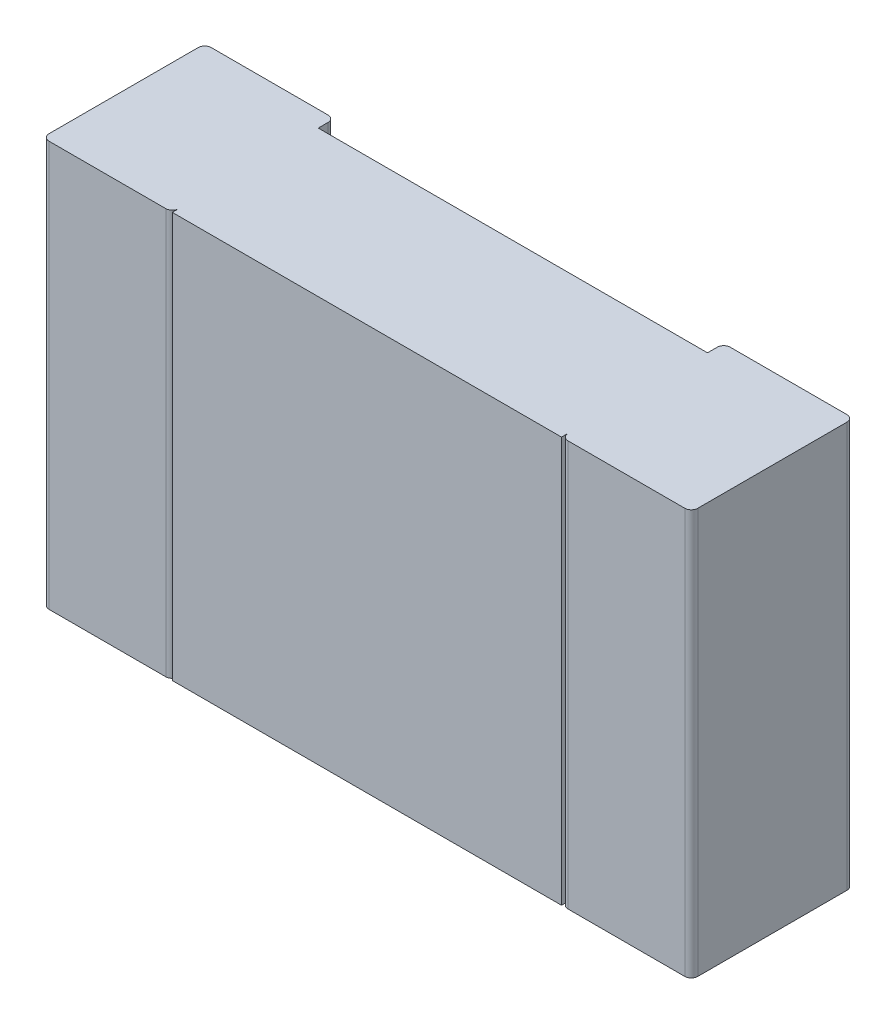
ISO-10303-21;
HEADER;
FILE_DESCRIPTION(('STEP AP214'),'2;1');
FILE_NAME('part.step','',(''),(''),'','','');
FILE_SCHEMA(('AUTOMOTIVE_DESIGN { 1 0 10303 214 1 1 1 1 }'));
ENDSEC;
DATA;
#1=APPLICATION_CONTEXT('core data for automotive mechanical design processes');
#2=APPLICATION_PROTOCOL_DEFINITION('international standard','automotive_design',2000,#1);
#3=PRODUCT_CONTEXT('',#1,'mechanical');
#4=PRODUCT('Part','Part','',(#3));
#5=PRODUCT_RELATED_PRODUCT_CATEGORY('part','',(#4));
#6=PRODUCT_DEFINITION_FORMATION('','',#4);
#7=PRODUCT_DEFINITION_CONTEXT('part definition',#1,'design');
#8=PRODUCT_DEFINITION('design','',#6,#7);
#9=PRODUCT_DEFINITION_SHAPE('','',#8);
#10=(LENGTH_UNIT() NAMED_UNIT(*) SI_UNIT(.MILLI.,.METRE.));
#11=(NAMED_UNIT(*) PLANE_ANGLE_UNIT() SI_UNIT($,.RADIAN.));
#12=(NAMED_UNIT(*) SI_UNIT($,.STERADIAN.) SOLID_ANGLE_UNIT());
#13=UNCERTAINTY_MEASURE_WITH_UNIT(LENGTH_MEASURE(1.E-05),#10,'distance_accuracy_value','');
#14=(GEOMETRIC_REPRESENTATION_CONTEXT(3) GLOBAL_UNCERTAINTY_ASSIGNED_CONTEXT((#13)) GLOBAL_UNIT_ASSIGNED_CONTEXT((#10,
#11,#12)) REPRESENTATION_CONTEXT('',''));
#15=CARTESIAN_POINT('',(0.,0.,0.));
#16=DIRECTION('',(0.,0.,1.));
#17=DIRECTION('',(1.,0.,0.));
#18=AXIS2_PLACEMENT_3D('',#15,#16,#17);
#19=CARTESIAN_POINT('',(-1.,-0.625,0.));
#20=DIRECTION('',(0.,0.,1.));
#21=DIRECTION('',(1.,0.,0.));
#22=AXIS2_PLACEMENT_3D('',#19,#20,#21);
#23=PLANE('',#22);
#24=DIRECTION('',(1.,0.,0.));
#25=VECTOR('',#24,1.);
#26=CARTESIAN_POINT('',(-1.,-0.625,0.));
#27=LINE('',#26,#25);
#28=CARTESIAN_POINT('',(-0.62,-0.625,0.));
#29=VERTEX_POINT('',#28);
#30=CARTESIAN_POINT('',(-0.98,-0.625,0.));
#31=VERTEX_POINT('',#30);
#32=EDGE_CURVE('E175',#29,#31,#27,.F.);
#33=ORIENTED_EDGE('',*,*,#32,.T.);
#34=DIRECTION('',(0.,1.,0.));
#35=VECTOR('',#34,1.);
#36=CARTESIAN_POINT('',(-0.98,-0.625,0.));
#37=LINE('',#36,#35);
#38=CARTESIAN_POINT('',(-0.98,0.625,0.));
#39=VERTEX_POINT('',#38);
#40=EDGE_CURVE('E150',#39,#31,#37,.F.);
#41=ORIENTED_EDGE('',*,*,#40,.F.);
#42=DIRECTION('',(1.,0.,0.));
#43=VECTOR('',#42,1.);
#44=CARTESIAN_POINT('',(-1.,0.625,0.));
#45=LINE('',#44,#43);
#46=CARTESIAN_POINT('',(-0.62,0.625,0.));
#47=VERTEX_POINT('',#46);
#48=EDGE_CURVE('E285',#47,#39,#45,.F.);
#49=ORIENTED_EDGE('',*,*,#48,.F.);
#50=DIRECTION('',(0.,1.,0.));
#51=VECTOR('',#50,1.);
#52=CARTESIAN_POINT('',(-0.62,-0.625,0.));
#53=LINE('',#52,#51);
#54=EDGE_CURVE('E176',#29,#47,#53,.T.);
#55=ORIENTED_EDGE('',*,*,#54,.F.);
#56=EDGE_LOOP('',(#33,#41,#49,#55));
#57=FACE_BOUND('',#56,.T.);
#58=ADVANCED_FACE('F16',(#57),#23,.F.);
#59=CARTESIAN_POINT('',(-0.98,-0.625,0.02));
#60=DIRECTION('',(0.,1.,0.));
#61=DIRECTION('',(0.,0.,1.));
#62=AXIS2_PLACEMENT_3D('',#59,#60,#61);
#63=CYLINDRICAL_SURFACE('',#62,0.02);
#64=ORIENTED_EDGE('',*,*,#40,.T.);
#65=CARTESIAN_POINT('',(-0.98,-0.625,0.02));
#66=DIRECTION('',(0.,1.,0.));
#67=DIRECTION('',(0.,0.,1.));
#68=AXIS2_PLACEMENT_3D('',#65,#66,#67);
#69=CIRCLE('',#68,0.02);
#70=CARTESIAN_POINT('',(-1.,-0.625,0.02));
#71=VERTEX_POINT('',#70);
#72=EDGE_CURVE('E19',#31,#71,#69,.T.);
#73=ORIENTED_EDGE('',*,*,#72,.T.);
#74=DIRECTION('',(0.,1.,0.));
#75=VECTOR('',#74,1.);
#76=CARTESIAN_POINT('',(-1.,-0.625,0.02));
#77=LINE('',#76,#75);
#78=CARTESIAN_POINT('',(-1.,0.625,0.02));
#79=VERTEX_POINT('',#78);
#80=EDGE_CURVE('E157',#71,#79,#77,.T.);
#81=ORIENTED_EDGE('',*,*,#80,.T.);
#82=CARTESIAN_POINT('',(-0.98,0.625,0.02));
#83=DIRECTION('',(0.,1.,0.));
#84=DIRECTION('',(0.,0.,1.));
#85=AXIS2_PLACEMENT_3D('',#82,#83,#84);
#86=CIRCLE('',#85,0.02);
#87=EDGE_CURVE('E283',#39,#79,#86,.T.);
#88=ORIENTED_EDGE('',*,*,#87,.F.);
#89=EDGE_LOOP('',(#64,#73,#81,#88));
#90=FACE_BOUND('',#89,.T.);
#91=ADVANCED_FACE('F174',(#90),#63,.T.);
#92=CARTESIAN_POINT('',(-1.,-0.625,0.));
#93=DIRECTION('',(1.,0.,0.));
#94=DIRECTION('',(0.,0.,-1.));
#95=AXIS2_PLACEMENT_3D('',#92,#93,#94);
#96=PLANE('',#95);
#97=DIRECTION('',(0.,0.,1.));
#98=VECTOR('',#97,1.);
#99=CARTESIAN_POINT('',(-1.,0.625,0.));
#100=LINE('',#99,#98);
#101=CARTESIAN_POINT('',(-1.,0.625,0.48));
#102=VERTEX_POINT('',#101);
#103=EDGE_CURVE('E162',#79,#102,#100,.T.);
#104=ORIENTED_EDGE('',*,*,#103,.F.);
#105=ORIENTED_EDGE('',*,*,#80,.F.);
#106=DIRECTION('',(0.,0.,1.));
#107=VECTOR('',#106,1.);
#108=CARTESIAN_POINT('',(-1.,-0.625,0.));
#109=LINE('',#108,#107);
#110=CARTESIAN_POINT('',(-1.,-0.625,0.48));
#111=VERTEX_POINT('',#110);
#112=EDGE_CURVE('E161',#71,#111,#109,.T.);
#113=ORIENTED_EDGE('',*,*,#112,.T.);
#114=DIRECTION('',(0.,1.,0.));
#115=VECTOR('',#114,1.);
#116=CARTESIAN_POINT('',(-1.,-0.625,0.48));
#117=LINE('',#116,#115);
#118=EDGE_CURVE('E163',#102,#111,#117,.F.);
#119=ORIENTED_EDGE('',*,*,#118,.F.);
#120=EDGE_LOOP('',(#104,#105,#113,#119));
#121=FACE_BOUND('',#120,.T.);
#122=ADVANCED_FACE('F159',(#121),#96,.F.);
#123=CARTESIAN_POINT('',(-0.98,-0.625,0.48));
#124=DIRECTION('',(0.,1.,0.));
#125=DIRECTION('',(0.,0.,1.));
#126=AXIS2_PLACEMENT_3D('',#123,#124,#125);
#127=CYLINDRICAL_SURFACE('',#126,0.02);
#128=CARTESIAN_POINT('',(-0.98,0.625,0.48));
#129=DIRECTION('',(0.,1.,0.));
#130=DIRECTION('',(0.,0.,1.));
#131=AXIS2_PLACEMENT_3D('',#128,#129,#130);
#132=CIRCLE('',#131,0.02);
#133=CARTESIAN_POINT('',(-0.98,0.625,0.5));
#134=VERTEX_POINT('',#133);
#135=EDGE_CURVE('E281',#102,#134,#132,.T.);
#136=ORIENTED_EDGE('',*,*,#135,.F.);
#137=ORIENTED_EDGE('',*,*,#118,.T.);
#138=CARTESIAN_POINT('',(-0.98,-0.625,0.48));
#139=DIRECTION('',(0.,1.,0.));
#140=DIRECTION('',(0.,0.,1.));
#141=AXIS2_PLACEMENT_3D('',#138,#139,#140);
#142=CIRCLE('',#141,0.02);
#143=CARTESIAN_POINT('',(-0.98,-0.625,0.5));
#144=VERTEX_POINT('',#143);
#145=EDGE_CURVE('E172',#111,#144,#142,.T.);
#146=ORIENTED_EDGE('',*,*,#145,.T.);
#147=DIRECTION('',(0.,1.,0.));
#148=VECTOR('',#147,1.);
#149=CARTESIAN_POINT('',(-0.98,-0.625,0.5));
#150=LINE('',#149,#148);
#151=EDGE_CURVE('E245',#134,#144,#150,.F.);
#152=ORIENTED_EDGE('',*,*,#151,.F.);
#153=EDGE_LOOP('',(#136,#137,#146,#152));
#154=FACE_BOUND('',#153,.T.);
#155=ADVANCED_FACE('F377',(#154),#127,.T.);
#156=CARTESIAN_POINT('',(-1.,-0.625,0.5));
#157=DIRECTION('',(0.,0.,1.));
#158=DIRECTION('',(1.,0.,0.));
#159=AXIS2_PLACEMENT_3D('',#156,#157,#158);
#160=PLANE('',#159);
#161=DIRECTION('',(1.,0.,0.));
#162=VECTOR('',#161,1.);
#163=CARTESIAN_POINT('',(-1.,-0.625,0.5));
#164=LINE('',#163,#162);
#165=CARTESIAN_POINT('',(-0.62,-0.625,0.5));
#166=VERTEX_POINT('',#165);
#167=EDGE_CURVE('E301',#144,#166,#164,.T.);
#168=ORIENTED_EDGE('',*,*,#167,.T.);
#169=DIRECTION('',(0.,1.,0.));
#170=VECTOR('',#169,1.);
#171=CARTESIAN_POINT('',(-0.62,-0.625,0.5));
#172=LINE('',#171,#170);
#173=CARTESIAN_POINT('',(-0.62,0.625,0.5));
#174=VERTEX_POINT('',#173);
#175=EDGE_CURVE('E242',#174,#166,#172,.F.);
#176=ORIENTED_EDGE('',*,*,#175,.F.);
#177=DIRECTION('',(1.,0.,0.));
#178=VECTOR('',#177,1.);
#179=CARTESIAN_POINT('',(-1.,0.625,0.5));
#180=LINE('',#179,#178);
#181=EDGE_CURVE('E280',#134,#174,#180,.T.);
#182=ORIENTED_EDGE('',*,*,#181,.F.);
#183=ORIENTED_EDGE('',*,*,#151,.T.);
#184=EDGE_LOOP('',(#168,#176,#182,#183));
#185=FACE_BOUND('',#184,.T.);
#186=ADVANCED_FACE('F379',(#185),#160,.T.);
#187=CARTESIAN_POINT('',(-0.62,-0.625,0.48));
#188=DIRECTION('',(0.,1.,0.));
#189=DIRECTION('',(0.,0.,1.));
#190=AXIS2_PLACEMENT_3D('',#187,#188,#189);
#191=CYLINDRICAL_SURFACE('',#190,0.02);
#192=ORIENTED_EDGE('',*,*,#175,.T.);
#193=CARTESIAN_POINT('',(-0.62,-0.625,0.48));
#194=DIRECTION('',(0.,1.,0.));
#195=DIRECTION('',(0.,0.,1.));
#196=AXIS2_PLACEMENT_3D('',#193,#194,#195);
#197=CIRCLE('',#196,0.02);
#198=CARTESIAN_POINT('',(-0.6,-0.625,0.48));
#199=VERTEX_POINT('',#198);
#200=EDGE_CURVE('E299',#166,#199,#197,.T.);
#201=ORIENTED_EDGE('',*,*,#200,.T.);
#202=DIRECTION('',(0.,1.,0.));
#203=VECTOR('',#202,1.);
#204=CARTESIAN_POINT('',(-0.6,-0.625,0.48));
#205=LINE('',#204,#203);
#206=CARTESIAN_POINT('',(-0.6,0.625,0.48));
#207=VERTEX_POINT('',#206);
#208=EDGE_CURVE('E234',#199,#207,#205,.T.);
#209=ORIENTED_EDGE('',*,*,#208,.T.);
#210=CARTESIAN_POINT('',(-0.62,0.625,0.48));
#211=DIRECTION('',(0.,1.,0.));
#212=DIRECTION('',(0.,0.,1.));
#213=AXIS2_PLACEMENT_3D('',#210,#211,#212);
#214=CIRCLE('',#213,0.02);
#215=EDGE_CURVE('E278',#174,#207,#214,.T.);
#216=ORIENTED_EDGE('',*,*,#215,.F.);
#217=EDGE_LOOP('',(#192,#201,#209,#216));
#218=FACE_BOUND('',#217,.T.);
#219=ADVANCED_FACE('F384',(#218),#191,.T.);
#220=CARTESIAN_POINT('',(-0.6,-0.625,0.45));
#221=DIRECTION('',(1.,0.,0.));
#222=DIRECTION('',(0.,0.,-1.));
#223=AXIS2_PLACEMENT_3D('',#220,#221,#222);
#224=PLANE('',#223);
#225=DIRECTION('',(0.,0.,1.));
#226=VECTOR('',#225,1.);
#227=CARTESIAN_POINT('',(-0.6,0.625,0.45));
#228=LINE('',#227,#226);
#229=CARTESIAN_POINT('',(-0.6,0.625,0.5));
#230=VERTEX_POINT('',#229);
#231=EDGE_CURVE('E230',#207,#230,#228,.T.);
#232=ORIENTED_EDGE('',*,*,#231,.F.);
#233=ORIENTED_EDGE('',*,*,#208,.F.);
#234=DIRECTION('',(0.,0.,1.));
#235=VECTOR('',#234,1.);
#236=CARTESIAN_POINT('',(-0.6,-0.625,0.45));
#237=LINE('',#236,#235);
#238=CARTESIAN_POINT('',(-0.6,-0.625,0.5));
#239=VERTEX_POINT('',#238);
#240=EDGE_CURVE('E258',#199,#239,#237,.T.);
#241=ORIENTED_EDGE('',*,*,#240,.T.);
#242=DIRECTION('',(0.,1.,0.));
#243=VECTOR('',#242,1.);
#244=CARTESIAN_POINT('',(-0.6,-0.625,0.5));
#245=LINE('',#244,#243);
#246=EDGE_CURVE('E226',#230,#239,#245,.F.);
#247=ORIENTED_EDGE('',*,*,#246,.F.);
#248=EDGE_LOOP('',(#232,#233,#241,#247));
#249=FACE_BOUND('',#248,.T.);
#250=ADVANCED_FACE('F387',(#249),#224,.F.);
#251=CARTESIAN_POINT('',(-0.6,-0.625,0.5));
#252=DIRECTION('',(0.,0.,1.));
#253=DIRECTION('',(1.,0.,0.));
#254=AXIS2_PLACEMENT_3D('',#251,#252,#253);
#255=PLANE('',#254);
#256=DIRECTION('',(0.,1.,0.));
#257=VECTOR('',#256,1.);
#258=CARTESIAN_POINT('',(0.6,-0.625,0.5));
#259=LINE('',#258,#257);
#260=CARTESIAN_POINT('',(0.6,0.625,0.5));
#261=VERTEX_POINT('',#260);
#262=CARTESIAN_POINT('',(0.6,-0.625,0.5));
#263=VERTEX_POINT('',#262);
#264=EDGE_CURVE('E214',#261,#263,#259,.F.);
#265=ORIENTED_EDGE('',*,*,#264,.F.);
#266=DIRECTION('',(1.,0.,0.));
#267=VECTOR('',#266,1.);
#268=CARTESIAN_POINT('',(-0.6,0.625,0.5));
#269=LINE('',#268,#267);
#270=EDGE_CURVE('E218',#230,#261,#269,.T.);
#271=ORIENTED_EDGE('',*,*,#270,.F.);
#272=ORIENTED_EDGE('',*,*,#246,.T.);
#273=DIRECTION('',(1.,0.,0.));
#274=VECTOR('',#273,1.);
#275=CARTESIAN_POINT('',(-0.6,-0.625,0.5));
#276=LINE('',#275,#274);
#277=EDGE_CURVE('E253',#239,#263,#276,.T.);
#278=ORIENTED_EDGE('',*,*,#277,.T.);
#279=EDGE_LOOP('',(#265,#271,#272,#278));
#280=FACE_BOUND('',#279,.T.);
#281=ADVANCED_FACE('F392',(#280),#255,.T.);
#282=CARTESIAN_POINT('',(0.6,-0.625,0.45));
#283=DIRECTION('',(1.,0.,0.));
#284=DIRECTION('',(0.,0.,-1.));
#285=AXIS2_PLACEMENT_3D('',#282,#283,#284);
#286=PLANE('',#285);
#287=DIRECTION('',(0.,0.,1.));
#288=VECTOR('',#287,1.);
#289=CARTESIAN_POINT('',(0.6,0.625,0.45));
#290=LINE('',#289,#288);
#291=CARTESIAN_POINT('',(0.6,0.625,0.48));
#292=VERTEX_POINT('',#291);
#293=EDGE_CURVE('E215',#261,#292,#290,.F.);
#294=ORIENTED_EDGE('',*,*,#293,.F.);
#295=ORIENTED_EDGE('',*,*,#264,.T.);
#296=DIRECTION('',(0.,0.,1.));
#297=VECTOR('',#296,1.);
#298=CARTESIAN_POINT('',(0.6,-0.625,0.45));
#299=LINE('',#298,#297);
#300=CARTESIAN_POINT('',(0.6,-0.625,0.48));
#301=VERTEX_POINT('',#300);
#302=EDGE_CURVE('E249',#263,#301,#299,.F.);
#303=ORIENTED_EDGE('',*,*,#302,.T.);
#304=DIRECTION('',(0.,1.,0.));
#305=VECTOR('',#304,1.);
#306=CARTESIAN_POINT('',(0.6,-0.625,0.48));
#307=LINE('',#306,#305);
#308=EDGE_CURVE('E212',#292,#301,#307,.F.);
#309=ORIENTED_EDGE('',*,*,#308,.F.);
#310=EDGE_LOOP('',(#294,#295,#303,#309));
#311=FACE_BOUND('',#310,.T.);
#312=ADVANCED_FACE('F398',(#311),#286,.T.);
#313=CARTESIAN_POINT('',(0.6,-0.625,0.));
#314=DIRECTION('',(0.,0.,1.));
#315=DIRECTION('',(1.,0.,0.));
#316=AXIS2_PLACEMENT_3D('',#313,#314,#315);
#317=PLANE('',#316);
#318=DIRECTION('',(1.,0.,0.));
#319=VECTOR('',#318,1.);
#320=CARTESIAN_POINT('',(0.6,-0.625,0.));
#321=LINE('',#320,#319);
#322=CARTESIAN_POINT('',(0.98,-0.625,0.));
#323=VERTEX_POINT('',#322);
#324=CARTESIAN_POINT('',(0.62,-0.625,0.));
#325=VERTEX_POINT('',#324);
#326=EDGE_CURVE('E252',#323,#325,#321,.F.);
#327=ORIENTED_EDGE('',*,*,#326,.T.);
#328=DIRECTION('',(0.,1.,0.));
#329=VECTOR('',#328,1.);
#330=CARTESIAN_POINT('',(0.62,-0.625,0.));
#331=LINE('',#330,#329);
#332=CARTESIAN_POINT('',(0.62,0.625,0.));
#333=VERTEX_POINT('',#332);
#334=EDGE_CURVE('E221',#333,#325,#331,.F.);
#335=ORIENTED_EDGE('',*,*,#334,.F.);
#336=DIRECTION('',(1.,0.,0.));
#337=VECTOR('',#336,1.);
#338=CARTESIAN_POINT('',(0.6,0.625,0.));
#339=LINE('',#338,#337);
#340=CARTESIAN_POINT('',(0.98,0.625,0.));
#341=VERTEX_POINT('',#340);
#342=EDGE_CURVE('E217',#341,#333,#339,.F.);
#343=ORIENTED_EDGE('',*,*,#342,.F.);
#344=DIRECTION('',(0.,1.,0.));
#345=VECTOR('',#344,1.);
#346=CARTESIAN_POINT('',(0.98,-0.625,0.));
#347=LINE('',#346,#345);
#348=EDGE_CURVE('E203',#323,#341,#347,.T.);
#349=ORIENTED_EDGE('',*,*,#348,.F.);
#350=EDGE_LOOP('',(#327,#335,#343,#349));
#351=FACE_BOUND('',#350,.T.);
#352=ADVANCED_FACE('F354',(#351),#317,.F.);
#353=CARTESIAN_POINT('',(0.62,-0.625,0.48));
#354=DIRECTION('',(0.,1.,0.));
#355=DIRECTION('',(0.,0.,1.));
#356=AXIS2_PLACEMENT_3D('',#353,#354,#355);
#357=CYLINDRICAL_SURFACE('',#356,0.02);
#358=CARTESIAN_POINT('',(0.62,0.625,0.48));
#359=DIRECTION('',(0.,1.,0.));
#360=DIRECTION('',(0.,0.,1.));
#361=AXIS2_PLACEMENT_3D('',#358,#359,#360);
#362=CIRCLE('',#361,0.02);
#363=CARTESIAN_POINT('',(0.62,0.625,0.5));
#364=VERTEX_POINT('',#363);
#365=EDGE_CURVE('E272',#292,#364,#362,.T.);
#366=ORIENTED_EDGE('',*,*,#365,.F.);
#367=ORIENTED_EDGE('',*,*,#308,.T.);
#368=CARTESIAN_POINT('',(0.62,-0.625,0.48));
#369=DIRECTION('',(0.,1.,0.));
#370=DIRECTION('',(0.,0.,1.));
#371=AXIS2_PLACEMENT_3D('',#368,#369,#370);
#372=CIRCLE('',#371,0.02);
#373=CARTESIAN_POINT('',(0.62,-0.625,0.5));
#374=VERTEX_POINT('',#373);
#375=EDGE_CURVE('E294',#301,#374,#372,.T.);
#376=ORIENTED_EDGE('',*,*,#375,.T.);
#377=DIRECTION('',(0.,1.,0.));
#378=VECTOR('',#377,1.);
#379=CARTESIAN_POINT('',(0.62,-0.625,0.5));
#380=LINE('',#379,#378);
#381=EDGE_CURVE('E210',#364,#374,#380,.F.);
#382=ORIENTED_EDGE('',*,*,#381,.F.);
#383=EDGE_LOOP('',(#366,#367,#376,#382));
#384=FACE_BOUND('',#383,.T.);
#385=ADVANCED_FACE('F402',(#384),#357,.T.);
#386=CARTESIAN_POINT('',(0.6,-0.625,0.5));
#387=DIRECTION('',(0.,0.,1.));
#388=DIRECTION('',(1.,0.,0.));
#389=AXIS2_PLACEMENT_3D('',#386,#387,#388);
#390=PLANE('',#389);
#391=DIRECTION('',(1.,0.,0.));
#392=VECTOR('',#391,1.);
#393=CARTESIAN_POINT('',(0.6,-0.625,0.5));
#394=LINE('',#393,#392);
#395=CARTESIAN_POINT('',(0.98,-0.625,0.5));
#396=VERTEX_POINT('',#395);
#397=EDGE_CURVE('E293',#374,#396,#394,.T.);
#398=ORIENTED_EDGE('',*,*,#397,.T.);
#399=DIRECTION('',(0.,1.,0.));
#400=VECTOR('',#399,1.);
#401=CARTESIAN_POINT('',(0.98,-0.625,0.5));
#402=LINE('',#401,#400);
#403=CARTESIAN_POINT('',(0.98,0.625,0.5));
#404=VERTEX_POINT('',#403);
#405=EDGE_CURVE('E208',#404,#396,#402,.F.);
#406=ORIENTED_EDGE('',*,*,#405,.F.);
#407=DIRECTION('',(1.,0.,0.));
#408=VECTOR('',#407,1.);
#409=CARTESIAN_POINT('',(0.6,0.625,0.5));
#410=LINE('',#409,#408);
#411=EDGE_CURVE('E271',#364,#404,#410,.T.);
#412=ORIENTED_EDGE('',*,*,#411,.F.);
#413=ORIENTED_EDGE('',*,*,#381,.T.);
#414=EDGE_LOOP('',(#398,#406,#412,#413));
#415=FACE_BOUND('',#414,.T.);
#416=ADVANCED_FACE('F407',(#415),#390,.T.);
#417=CARTESIAN_POINT('',(0.98,-0.625,0.48));
#418=DIRECTION('',(0.,1.,0.));
#419=DIRECTION('',(0.,0.,1.));
#420=AXIS2_PLACEMENT_3D('',#417,#418,#419);
#421=CYLINDRICAL_SURFACE('',#420,0.02);
#422=ORIENTED_EDGE('',*,*,#405,.T.);
#423=CARTESIAN_POINT('',(0.98,-0.625,0.48));
#424=DIRECTION('',(0.,1.,0.));
#425=DIRECTION('',(0.,0.,1.));
#426=AXIS2_PLACEMENT_3D('',#423,#424,#425);
#427=CIRCLE('',#426,0.02);
#428=CARTESIAN_POINT('',(1.,-0.625,0.48));
#429=VERTEX_POINT('',#428);
#430=EDGE_CURVE('E290',#396,#429,#427,.T.);
#431=ORIENTED_EDGE('',*,*,#430,.T.);
#432=DIRECTION('',(0.,1.,0.));
#433=VECTOR('',#432,1.);
#434=CARTESIAN_POINT('',(1.,-0.625,0.48));
#435=LINE('',#434,#433);
#436=CARTESIAN_POINT('',(1.,0.625,0.48));
#437=VERTEX_POINT('',#436);
#438=EDGE_CURVE('E205',#437,#429,#435,.F.);
#439=ORIENTED_EDGE('',*,*,#438,.F.);
#440=CARTESIAN_POINT('',(0.98,0.625,0.48));
#441=DIRECTION('',(0.,1.,0.));
#442=DIRECTION('',(0.,0.,1.));
#443=AXIS2_PLACEMENT_3D('',#440,#441,#442);
#444=CIRCLE('',#443,0.02);
#445=EDGE_CURVE('E269',#404,#437,#444,.T.);
#446=ORIENTED_EDGE('',*,*,#445,.F.);
#447=EDGE_LOOP('',(#422,#431,#439,#446));
#448=FACE_BOUND('',#447,.T.);
#449=ADVANCED_FACE('F410',(#448),#421,.T.);
#450=CARTESIAN_POINT('',(1.,-0.625,0.));
#451=DIRECTION('',(1.,0.,0.));
#452=DIRECTION('',(0.,0.,-1.));
#453=AXIS2_PLACEMENT_3D('',#450,#451,#452);
#454=PLANE('',#453);
#455=DIRECTION('',(0.,0.,1.));
#456=VECTOR('',#455,1.);
#457=CARTESIAN_POINT('',(1.,0.625,0.));
#458=LINE('',#457,#456);
#459=CARTESIAN_POINT('',(1.,0.625,0.02));
#460=VERTEX_POINT('',#459);
#461=EDGE_CURVE('E268',#437,#460,#458,.F.);
#462=ORIENTED_EDGE('',*,*,#461,.F.);
#463=ORIENTED_EDGE('',*,*,#438,.T.);
#464=DIRECTION('',(0.,0.,1.));
#465=VECTOR('',#464,1.);
#466=CARTESIAN_POINT('',(1.,-0.625,0.));
#467=LINE('',#466,#465);
#468=CARTESIAN_POINT('',(1.,-0.625,0.02));
#469=VERTEX_POINT('',#468);
#470=EDGE_CURVE('E289',#429,#469,#467,.F.);
#471=ORIENTED_EDGE('',*,*,#470,.T.);
#472=DIRECTION('',(0.,1.,0.));
#473=VECTOR('',#472,1.);
#474=CARTESIAN_POINT('',(1.,-0.625,0.02));
#475=LINE('',#474,#473);
#476=EDGE_CURVE('E180',#460,#469,#475,.F.);
#477=ORIENTED_EDGE('',*,*,#476,.F.);
#478=EDGE_LOOP('',(#462,#463,#471,#477));
#479=FACE_BOUND('',#478,.T.);
#480=ADVANCED_FACE('F347',(#479),#454,.T.);
#481=CARTESIAN_POINT('',(0.98,-0.625,0.02));
#482=DIRECTION('',(0.,1.,0.));
#483=DIRECTION('',(0.,0.,1.));
#484=AXIS2_PLACEMENT_3D('',#481,#482,#483);
#485=CYLINDRICAL_SURFACE('',#484,0.02);
#486=CARTESIAN_POINT('',(0.98,0.625,0.02));
#487=DIRECTION('',(0.,1.,0.));
#488=DIRECTION('',(0.,0.,1.));
#489=AXIS2_PLACEMENT_3D('',#486,#487,#488);
#490=CIRCLE('',#489,0.02);
#491=EDGE_CURVE('E188',#460,#341,#490,.T.);
#492=ORIENTED_EDGE('',*,*,#491,.F.);
#493=ORIENTED_EDGE('',*,*,#476,.T.);
#494=CARTESIAN_POINT('',(0.98,-0.625,0.02));
#495=DIRECTION('',(0.,1.,0.));
#496=DIRECTION('',(0.,0.,1.));
#497=AXIS2_PLACEMENT_3D('',#494,#495,#496);
#498=CIRCLE('',#497,0.02);
#499=EDGE_CURVE('E224',#469,#323,#498,.T.);
#500=ORIENTED_EDGE('',*,*,#499,.T.);
#501=ORIENTED_EDGE('',*,*,#348,.T.);
#502=EDGE_LOOP('',(#492,#493,#500,#501));
#503=FACE_BOUND('',#502,.T.);
#504=ADVANCED_FACE('F351',(#503),#485,.T.);
#505=CARTESIAN_POINT('',(-0.62,-0.625,0.02));
#506=DIRECTION('',(0.,1.,0.));
#507=DIRECTION('',(0.,0.,1.));
#508=AXIS2_PLACEMENT_3D('',#505,#506,#507);
#509=CYLINDRICAL_SURFACE('',#508,0.02);
#510=CARTESIAN_POINT('',(-0.62,0.625,0.02));
#511=DIRECTION('',(0.,1.,0.));
#512=DIRECTION('',(0.,0.,1.));
#513=AXIS2_PLACEMENT_3D('',#510,#511,#512);
#514=CIRCLE('',#513,0.02);
#515=CARTESIAN_POINT('',(-0.6,0.625,0.02));
#516=VERTEX_POINT('',#515);
#517=EDGE_CURVE('E238',#516,#47,#514,.T.);
#518=ORIENTED_EDGE('',*,*,#517,.F.);
#519=DIRECTION('',(0.,1.,0.));
#520=VECTOR('',#519,1.);
#521=CARTESIAN_POINT('',(-0.6,-0.625,0.02));
#522=LINE('',#521,#520);
#523=CARTESIAN_POINT('',(-0.6,-0.625,0.02));
#524=VERTEX_POINT('',#523);
#525=EDGE_CURVE('E187',#524,#516,#522,.T.);
#526=ORIENTED_EDGE('',*,*,#525,.F.);
#527=CARTESIAN_POINT('',(-0.62,-0.625,0.02));
#528=DIRECTION('',(0.,1.,0.));
#529=DIRECTION('',(0.,0.,1.));
#530=AXIS2_PLACEMENT_3D('',#527,#528,#529);
#531=CIRCLE('',#530,0.02);
#532=EDGE_CURVE('E263',#524,#29,#531,.T.);
#533=ORIENTED_EDGE('',*,*,#532,.T.);
#534=ORIENTED_EDGE('',*,*,#54,.T.);
#535=EDGE_LOOP('',(#518,#526,#533,#534));
#536=FACE_BOUND('',#535,.T.);
#537=ADVANCED_FACE('F375',(#536),#509,.T.);
#538=CARTESIAN_POINT('',(0.62,-0.625,0.02));
#539=DIRECTION('',(0.,1.,0.));
#540=DIRECTION('',(0.,0.,1.));
#541=AXIS2_PLACEMENT_3D('',#538,#539,#540);
#542=CYLINDRICAL_SURFACE('',#541,0.02);
#543=ORIENTED_EDGE('',*,*,#334,.T.);
#544=CARTESIAN_POINT('',(0.62,-0.625,0.02));
#545=DIRECTION('',(0.,1.,0.));
#546=DIRECTION('',(0.,0.,1.));
#547=AXIS2_PLACEMENT_3D('',#544,#545,#546);
#548=CIRCLE('',#547,0.02);
#549=CARTESIAN_POINT('',(0.6,-0.625,0.02));
#550=VERTEX_POINT('',#549);
#551=EDGE_CURVE('E223',#325,#550,#548,.T.);
#552=ORIENTED_EDGE('',*,*,#551,.T.);
#553=DIRECTION('',(0.,1.,0.));
#554=VECTOR('',#553,1.);
#555=CARTESIAN_POINT('',(0.6,-0.625,0.02));
#556=LINE('',#555,#554);
#557=CARTESIAN_POINT('',(0.6,0.625,0.02));
#558=VERTEX_POINT('',#557);
#559=EDGE_CURVE('E322',#550,#558,#556,.T.);
#560=ORIENTED_EDGE('',*,*,#559,.T.);
#561=CARTESIAN_POINT('',(0.62,0.625,0.02));
#562=DIRECTION('',(0.,1.,0.));
#563=DIRECTION('',(0.,0.,1.));
#564=AXIS2_PLACEMENT_3D('',#561,#562,#563);
#565=CIRCLE('',#564,0.02);
#566=EDGE_CURVE('E274',#333,#558,#565,.T.);
#567=ORIENTED_EDGE('',*,*,#566,.F.);
#568=EDGE_LOOP('',(#543,#552,#560,#567));
#569=FACE_BOUND('',#568,.T.);
#570=ADVANCED_FACE('F363',(#569),#542,.T.);
#571=CARTESIAN_POINT('',(-0.6,-0.625,0.));
#572=DIRECTION('',(1.,0.,0.));
#573=DIRECTION('',(0.,0.,-1.));
#574=AXIS2_PLACEMENT_3D('',#571,#572,#573);
#575=PLANE('',#574);
#576=DIRECTION('',(0.,0.,-1.));
#577=VECTOR('',#576,1.);
#578=CARTESIAN_POINT('',(-0.6,0.625,0.));
#579=LINE('',#578,#577);
#580=CARTESIAN_POINT('',(-0.6,0.625,0.05));
#581=VERTEX_POINT('',#580);
#582=EDGE_CURVE('E198',#516,#581,#579,.F.);
#583=ORIENTED_EDGE('',*,*,#582,.T.);
#584=DIRECTION('',(0.,1.,0.));
#585=VECTOR('',#584,1.);
#586=CARTESIAN_POINT('',(-0.6,-0.625,0.05));
#587=LINE('',#586,#585);
#588=CARTESIAN_POINT('',(-0.6,-0.625,0.05));
#589=VERTEX_POINT('',#588);
#590=EDGE_CURVE('E191',#581,#589,#587,.F.);
#591=ORIENTED_EDGE('',*,*,#590,.T.);
#592=DIRECTION('',(0.,0.,-1.));
#593=VECTOR('',#592,1.);
#594=CARTESIAN_POINT('',(-0.6,-0.625,0.));
#595=LINE('',#594,#593);
#596=EDGE_CURVE('E184',#589,#524,#595,.T.);
#597=ORIENTED_EDGE('',*,*,#596,.T.);
#598=ORIENTED_EDGE('',*,*,#525,.T.);
#599=EDGE_LOOP('',(#583,#591,#597,#598));
#600=FACE_BOUND('',#599,.T.);
#601=ADVANCED_FACE('F372',(#600),#575,.T.);
#602=CARTESIAN_POINT('',(-0.95,-0.625,0.05));
#603=DIRECTION('',(0.,1.,0.));
#604=DIRECTION('',(0.,0.,1.));
#605=AXIS2_PLACEMENT_3D('',#602,#603,#604);
#606=PLANE('',#605);
#607=ORIENTED_EDGE('',*,*,#240,.F.);
#608=ORIENTED_EDGE('',*,*,#200,.F.);
#609=ORIENTED_EDGE('',*,*,#167,.F.);
#610=ORIENTED_EDGE('',*,*,#145,.F.);
#611=ORIENTED_EDGE('',*,*,#112,.F.);
#612=ORIENTED_EDGE('',*,*,#72,.F.);
#613=ORIENTED_EDGE('',*,*,#32,.F.);
#614=ORIENTED_EDGE('',*,*,#532,.F.);
#615=ORIENTED_EDGE('',*,*,#596,.F.);
#616=DIRECTION('',(1.,0.,0.));
#617=VECTOR('',#616,1.);
#618=CARTESIAN_POINT('',(-0.95,-0.625,0.05));
#619=LINE('',#618,#617);
#620=CARTESIAN_POINT('',(0.6,-0.625,0.05));
#621=VERTEX_POINT('',#620);
#622=EDGE_CURVE('E194',#589,#621,#619,.T.);
#623=ORIENTED_EDGE('',*,*,#622,.T.);
#624=DIRECTION('',(0.,0.,-1.));
#625=VECTOR('',#624,1.);
#626=CARTESIAN_POINT('',(0.6,-0.625,0.));
#627=LINE('',#626,#625);
#628=EDGE_CURVE('E200',#621,#550,#627,.T.);
#629=ORIENTED_EDGE('',*,*,#628,.T.);
#630=ORIENTED_EDGE('',*,*,#551,.F.);
#631=ORIENTED_EDGE('',*,*,#326,.F.);
#632=ORIENTED_EDGE('',*,*,#499,.F.);
#633=ORIENTED_EDGE('',*,*,#470,.F.);
#634=ORIENTED_EDGE('',*,*,#430,.F.);
#635=ORIENTED_EDGE('',*,*,#397,.F.);
#636=ORIENTED_EDGE('',*,*,#375,.F.);
#637=ORIENTED_EDGE('',*,*,#302,.F.);
#638=ORIENTED_EDGE('',*,*,#277,.F.);
#639=EDGE_LOOP('',(#607,#608,#609,#610,#611,#612,#613,#614,#615,#623,#629,#630,#631,#632,#633,
#634,#635,#636,#637,#638));
#640=FACE_BOUND('',#639,.T.);
#641=ADVANCED_FACE('F168',(#640),#606,.F.);
#642=CARTESIAN_POINT('',(0.6,-0.625,0.));
#643=DIRECTION('',(1.,0.,0.));
#644=DIRECTION('',(0.,0.,-1.));
#645=AXIS2_PLACEMENT_3D('',#642,#643,#644);
#646=PLANE('',#645);
#647=DIRECTION('',(0.,0.,-1.));
#648=VECTOR('',#647,1.);
#649=CARTESIAN_POINT('',(0.6,0.625,0.));
#650=LINE('',#649,#648);
#651=CARTESIAN_POINT('',(0.6,0.625,0.05));
#652=VERTEX_POINT('',#651);
#653=EDGE_CURVE('E33',#558,#652,#650,.F.);
#654=ORIENTED_EDGE('',*,*,#653,.F.);
#655=ORIENTED_EDGE('',*,*,#559,.F.);
#656=ORIENTED_EDGE('',*,*,#628,.F.);
#657=DIRECTION('',(0.,1.,0.));
#658=VECTOR('',#657,1.);
#659=CARTESIAN_POINT('',(0.6,-0.625,0.05));
#660=LINE('',#659,#658);
#661=EDGE_CURVE('E25',#621,#652,#660,.T.);
#662=ORIENTED_EDGE('',*,*,#661,.T.);
#663=EDGE_LOOP('',(#654,#655,#656,#662));
#664=FACE_BOUND('',#663,.T.);
#665=ADVANCED_FACE('F361',(#664),#646,.F.);
#666=CARTESIAN_POINT('',(-0.95,0.625,0.05));
#667=DIRECTION('',(0.,1.,0.));
#668=DIRECTION('',(0.,0.,1.));
#669=AXIS2_PLACEMENT_3D('',#666,#667,#668);
#670=PLANE('',#669);
#671=ORIENTED_EDGE('',*,*,#215,.T.);
#672=ORIENTED_EDGE('',*,*,#231,.T.);
#673=ORIENTED_EDGE('',*,*,#270,.T.);
#674=ORIENTED_EDGE('',*,*,#293,.T.);
#675=ORIENTED_EDGE('',*,*,#365,.T.);
#676=ORIENTED_EDGE('',*,*,#411,.T.);
#677=ORIENTED_EDGE('',*,*,#445,.T.);
#678=ORIENTED_EDGE('',*,*,#461,.T.);
#679=ORIENTED_EDGE('',*,*,#491,.T.);
#680=ORIENTED_EDGE('',*,*,#342,.T.);
#681=ORIENTED_EDGE('',*,*,#566,.T.);
#682=ORIENTED_EDGE('',*,*,#653,.T.);
#683=DIRECTION('',(1.,0.,0.));
#684=VECTOR('',#683,1.);
#685=CARTESIAN_POINT('',(-0.95,0.625,0.05));
#686=LINE('',#685,#684);
#687=EDGE_CURVE('E11',#652,#581,#686,.F.);
#688=ORIENTED_EDGE('',*,*,#687,.T.);
#689=ORIENTED_EDGE('',*,*,#582,.F.);
#690=ORIENTED_EDGE('',*,*,#517,.T.);
#691=ORIENTED_EDGE('',*,*,#48,.T.);
#692=ORIENTED_EDGE('',*,*,#87,.T.);
#693=ORIENTED_EDGE('',*,*,#103,.T.);
#694=ORIENTED_EDGE('',*,*,#135,.T.);
#695=ORIENTED_EDGE('',*,*,#181,.T.);
#696=EDGE_LOOP('',(#671,#672,#673,#674,#675,#676,#677,#678,#679,#680,#681,#682,#688,#689,#690,
#691,#692,#693,#694,#695));
#697=FACE_BOUND('',#696,.T.);
#698=ADVANCED_FACE('F341',(#697),#670,.T.);
#699=CARTESIAN_POINT('',(-0.95,-0.625,0.05));
#700=DIRECTION('',(0.,0.,1.));
#701=DIRECTION('',(1.,0.,0.));
#702=AXIS2_PLACEMENT_3D('',#699,#700,#701);
#703=PLANE('',#702);
#704=ORIENTED_EDGE('',*,*,#661,.F.);
#705=ORIENTED_EDGE('',*,*,#622,.F.);
#706=ORIENTED_EDGE('',*,*,#590,.F.);
#707=ORIENTED_EDGE('',*,*,#687,.F.);
#708=EDGE_LOOP('',(#704,#705,#706,#707));
#709=FACE_BOUND('',#708,.T.);
#710=ADVANCED_FACE('F366',(#709),#703,.F.);
#711=CLOSED_SHELL('',(#58,#91,#122,#155,#186,#219,#250,#281,#312,#352,#385,#416,#449,#480,#504,
#537,#570,#601,#641,#665,#698,#710));
#712=MANIFOLD_SOLID_BREP('B1',#711);
#713=ADVANCED_BREP_SHAPE_REPRESENTATION('',(#18,#712),#14);
#714=SHAPE_DEFINITION_REPRESENTATION(#9,#713);
ENDSEC;
END-ISO-10303-21;
